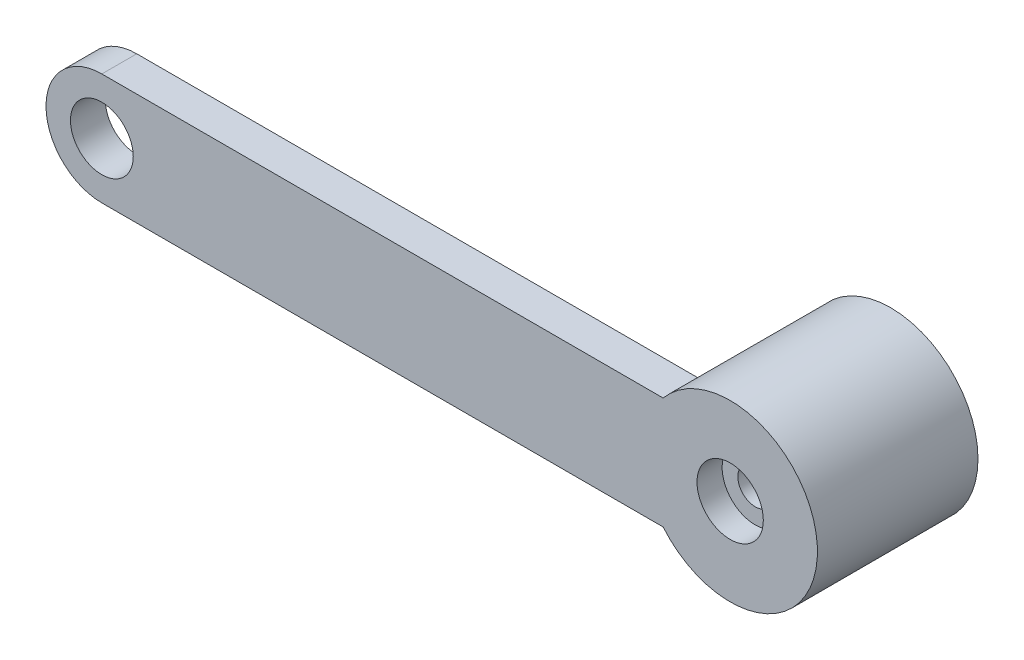
ISO-10303-21;
HEADER;
FILE_DESCRIPTION(('STEP AP214'),'2;1');
FILE_NAME('part.step','',(''),(''),'','','');
FILE_SCHEMA(('AUTOMOTIVE_DESIGN { 1 0 10303 214 1 1 1 1 }'));
ENDSEC;
DATA;
#1=APPLICATION_CONTEXT('core data for automotive mechanical design processes');
#2=APPLICATION_PROTOCOL_DEFINITION('international standard','automotive_design',2000,#1);
#3=PRODUCT_CONTEXT('',#1,'mechanical');
#4=PRODUCT('Part','Part','',(#3));
#5=PRODUCT_RELATED_PRODUCT_CATEGORY('part','',(#4));
#6=PRODUCT_DEFINITION_FORMATION('','',#4);
#7=PRODUCT_DEFINITION_CONTEXT('part definition',#1,'design');
#8=PRODUCT_DEFINITION('design','',#6,#7);
#9=PRODUCT_DEFINITION_SHAPE('','',#8);
#10=(LENGTH_UNIT() NAMED_UNIT(*) SI_UNIT(.MILLI.,.METRE.));
#11=(NAMED_UNIT(*) PLANE_ANGLE_UNIT() SI_UNIT($,.RADIAN.));
#12=(NAMED_UNIT(*) SI_UNIT($,.STERADIAN.) SOLID_ANGLE_UNIT());
#13=UNCERTAINTY_MEASURE_WITH_UNIT(LENGTH_MEASURE(1.E-05),#10,'distance_accuracy_value','');
#14=(GEOMETRIC_REPRESENTATION_CONTEXT(3) GLOBAL_UNCERTAINTY_ASSIGNED_CONTEXT((#13)) GLOBAL_UNIT_ASSIGNED_CONTEXT((#10,
#11,#12)) REPRESENTATION_CONTEXT('',''));
#15=CARTESIAN_POINT('',(0.,0.,0.));
#16=DIRECTION('',(0.,0.,1.));
#17=DIRECTION('',(1.,0.,0.));
#18=AXIS2_PLACEMENT_3D('',#15,#16,#17);
#19=CARTESIAN_POINT('',(52.6364834784347,0.,-18.001));
#20=DIRECTION('',(0.,0.,1.));
#21=DIRECTION('',(1.,0.,0.));
#22=AXIS2_PLACEMENT_3D('',#19,#20,#21);
#23=CYLINDRICAL_SURFACE('',#22,2.5);
#24=CARTESIAN_POINT('',(52.6364834784347,0.,-3.));
#25=DIRECTION('',(0.,0.,-1.));
#26=DIRECTION('',(-1.,0.,0.));
#27=AXIS2_PLACEMENT_3D('',#24,#25,#26);
#28=CIRCLE('',#27,2.5);
#29=CARTESIAN_POINT('',(50.1364834784347,0.,-3.));
#30=VERTEX_POINT('',#29);
#31=EDGE_CURVE('E144',#30,#30,#28,.F.);
#32=ORIENTED_EDGE('',*,*,#31,.F.);
#33=EDGE_LOOP('',(#32));
#34=FACE_BOUND('',#33,.T.);
#35=CARTESIAN_POINT('',(52.6364834784347,0.,1.4));
#36=DIRECTION('',(0.,0.,1.));
#37=DIRECTION('',(1.,0.,0.));
#38=AXIS2_PLACEMENT_3D('',#35,#36,#37);
#39=CIRCLE('',#38,2.5);
#40=CARTESIAN_POINT('',(55.1364834784347,0.,1.4));
#41=VERTEX_POINT('',#40);
#42=EDGE_CURVE('E43',#41,#41,#39,.F.);
#43=ORIENTED_EDGE('',*,*,#42,.F.);
#44=EDGE_LOOP('',(#43));
#45=FACE_BOUND('',#44,.T.);
#46=ADVANCED_FACE('F39',(#34,#45),#23,.F.);
#47=CARTESIAN_POINT('',(-37.3635165215653,0.,5.));
#48=DIRECTION('',(0.,0.,1.));
#49=DIRECTION('',(1.,0.,0.));
#50=AXIS2_PLACEMENT_3D('',#47,#48,#49);
#51=PLANE('',#50);
#52=CARTESIAN_POINT('',(52.6364834784347,0.,5.));
#53=DIRECTION('',(0.,0.,1.));
#54=DIRECTION('',(1.,0.,0.));
#55=AXIS2_PLACEMENT_3D('',#52,#53,#54);
#56=CIRCLE('',#55,4.75);
#57=CARTESIAN_POINT('',(57.3864834784347,0.,5.));
#58=VERTEX_POINT('',#57);
#59=EDGE_CURVE('E151',#58,#58,#56,.T.);
#60=ORIENTED_EDGE('',*,*,#59,.F.);
#61=EDGE_LOOP('',(#60));
#62=FACE_BOUND('',#61,.T.);
#63=CARTESIAN_POINT('',(-37.3635165215653,0.,5.));
#64=DIRECTION('',(0.,0.,1.));
#65=DIRECTION('',(1.,0.,0.));
#66=AXIS2_PLACEMENT_3D('',#63,#64,#65);
#67=CIRCLE('',#66,8.);
#68=CARTESIAN_POINT('',(-37.3635165215653,8.,5.));
#69=VERTEX_POINT('',#68);
#70=CARTESIAN_POINT('',(-37.3635165215653,-8.,5.));
#71=VERTEX_POINT('',#70);
#72=EDGE_CURVE('E93',#69,#71,#67,.T.);
#73=ORIENTED_EDGE('',*,*,#72,.T.);
#74=DIRECTION('',(1.,0.,0.));
#75=VECTOR('',#74,1.);
#76=CARTESIAN_POINT('',(-37.3635165215653,-8.,5.));
#77=LINE('',#76,#75);
#78=CARTESIAN_POINT('',(43.0317971222854,-8.,5.));
#79=VERTEX_POINT('',#78);
#80=EDGE_CURVE('E85',#71,#79,#77,.T.);
#81=ORIENTED_EDGE('',*,*,#80,.T.);
#82=CARTESIAN_POINT('',(52.6364834784347,0.,5.));
#83=DIRECTION('',(0.,0.,1.));
#84=DIRECTION('',(1.,0.,0.));
#85=AXIS2_PLACEMENT_3D('',#82,#83,#84);
#86=CIRCLE('',#85,12.5);
#87=CARTESIAN_POINT('',(43.0317971222854,8.,5.));
#88=VERTEX_POINT('',#87);
#89=EDGE_CURVE('E108',#79,#88,#86,.T.);
#90=ORIENTED_EDGE('',*,*,#89,.T.);
#91=DIRECTION('',(-1.,0.,0.));
#92=VECTOR('',#91,1.);
#93=CARTESIAN_POINT('',(-37.3635165215653,8.,5.));
#94=LINE('',#93,#92);
#95=EDGE_CURVE('E59',#88,#69,#94,.T.);
#96=ORIENTED_EDGE('',*,*,#95,.T.);
#97=EDGE_LOOP('',(#73,#81,#90,#96));
#98=FACE_BOUND('',#97,.T.);
#99=CARTESIAN_POINT('',(-37.3635165215653,0.,5.));
#100=DIRECTION('',(0.,0.,1.));
#101=DIRECTION('',(1.,0.,0.));
#102=AXIS2_PLACEMENT_3D('',#99,#100,#101);
#103=CIRCLE('',#102,4.5);
#104=CARTESIAN_POINT('',(-32.8635165215653,0.,5.));
#105=VERTEX_POINT('',#104);
#106=EDGE_CURVE('E119',#105,#105,#103,.T.);
#107=ORIENTED_EDGE('',*,*,#106,.F.);
#108=EDGE_LOOP('',(#107));
#109=FACE_BOUND('',#108,.T.);
#110=ADVANCED_FACE('F167',(#62,#98,#109),#51,.T.);
#111=CARTESIAN_POINT('',(-37.3635165215653,0.,0.));
#112=DIRECTION('',(0.,0.,1.));
#113=DIRECTION('',(1.,0.,0.));
#114=AXIS2_PLACEMENT_3D('',#111,#112,#113);
#115=PLANE('',#114);
#116=CARTESIAN_POINT('',(52.6364834784347,0.,0.));
#117=DIRECTION('',(0.,0.,-1.));
#118=DIRECTION('',(-1.,0.,0.));
#119=AXIS2_PLACEMENT_3D('',#116,#117,#118);
#120=CIRCLE('',#119,12.5);
#121=CARTESIAN_POINT('',(43.0317971222854,-8.,0.));
#122=VERTEX_POINT('',#121);
#123=CARTESIAN_POINT('',(43.0317971222854,8.,0.));
#124=VERTEX_POINT('',#123);
#125=EDGE_CURVE('E11',#122,#124,#120,.T.);
#126=ORIENTED_EDGE('',*,*,#125,.F.);
#127=DIRECTION('',(1.,0.,0.));
#128=VECTOR('',#127,1.);
#129=CARTESIAN_POINT('',(-37.3635165215653,-8.,0.));
#130=LINE('',#129,#128);
#131=CARTESIAN_POINT('',(-37.3635165215653,-8.,0.));
#132=VERTEX_POINT('',#131);
#133=EDGE_CURVE('E94',#132,#122,#130,.T.);
#134=ORIENTED_EDGE('',*,*,#133,.F.);
#135=CARTESIAN_POINT('',(-37.3635165215653,0.,0.));
#136=DIRECTION('',(0.,0.,1.));
#137=DIRECTION('',(1.,0.,0.));
#138=AXIS2_PLACEMENT_3D('',#135,#136,#137);
#139=CIRCLE('',#138,8.);
#140=CARTESIAN_POINT('',(-37.3635165215653,8.,0.));
#141=VERTEX_POINT('',#140);
#142=EDGE_CURVE('E91',#141,#132,#139,.T.);
#143=ORIENTED_EDGE('',*,*,#142,.F.);
#144=DIRECTION('',(-1.,0.,0.));
#145=VECTOR('',#144,1.);
#146=CARTESIAN_POINT('',(-37.3635165215653,8.,0.));
#147=LINE('',#146,#145);
#148=EDGE_CURVE('E77',#124,#141,#147,.T.);
#149=ORIENTED_EDGE('',*,*,#148,.F.);
#150=EDGE_LOOP('',(#126,#134,#143,#149));
#151=FACE_BOUND('',#150,.T.);
#152=CARTESIAN_POINT('',(-37.3635165215653,0.,0.));
#153=DIRECTION('',(0.,0.,1.));
#154=DIRECTION('',(1.,0.,0.));
#155=AXIS2_PLACEMENT_3D('',#152,#153,#154);
#156=CIRCLE('',#155,4.5);
#157=CARTESIAN_POINT('',(-32.8635165215653,0.,0.));
#158=VERTEX_POINT('',#157);
#159=EDGE_CURVE('E128',#158,#158,#156,.T.);
#160=ORIENTED_EDGE('',*,*,#159,.T.);
#161=EDGE_LOOP('',(#160));
#162=FACE_BOUND('',#161,.T.);
#163=ADVANCED_FACE('F88',(#151,#162),#115,.F.);
#164=CARTESIAN_POINT('',(-37.3635165215653,0.,5.));
#165=DIRECTION('',(0.,0.,-1.));
#166=DIRECTION('',(-1.,0.,0.));
#167=AXIS2_PLACEMENT_3D('',#164,#165,#166);
#168=CYLINDRICAL_SURFACE('',#167,8.);
#169=ORIENTED_EDGE('',*,*,#142,.T.);
#170=DIRECTION('',(0.,0.,-1.));
#171=VECTOR('',#170,1.);
#172=CARTESIAN_POINT('',(-37.3635165215653,-8.,5.));
#173=LINE('',#172,#171);
#174=EDGE_CURVE('E50',#71,#132,#173,.T.);
#175=ORIENTED_EDGE('',*,*,#174,.F.);
#176=ORIENTED_EDGE('',*,*,#72,.F.);
#177=DIRECTION('',(0.,0.,-1.));
#178=VECTOR('',#177,1.);
#179=CARTESIAN_POINT('',(-37.3635165215653,8.,5.));
#180=LINE('',#179,#178);
#181=EDGE_CURVE('E103',#69,#141,#180,.T.);
#182=ORIENTED_EDGE('',*,*,#181,.T.);
#183=EDGE_LOOP('',(#169,#175,#176,#182));
#184=FACE_BOUND('',#183,.T.);
#185=ADVANCED_FACE('F41',(#184),#168,.T.);
#186=CARTESIAN_POINT('',(-37.3635165215653,-8.,5.));
#187=DIRECTION('',(0.,1.,0.));
#188=DIRECTION('',(0.,0.,1.));
#189=AXIS2_PLACEMENT_3D('',#186,#187,#188);
#190=PLANE('',#189);
#191=ORIENTED_EDGE('',*,*,#133,.T.);
#192=DIRECTION('',(0.,0.,-1.));
#193=VECTOR('',#192,1.);
#194=CARTESIAN_POINT('',(43.0317971222854,-8.,5.));
#195=LINE('',#194,#193);
#196=EDGE_CURVE('E102',#79,#122,#195,.T.);
#197=ORIENTED_EDGE('',*,*,#196,.F.);
#198=ORIENTED_EDGE('',*,*,#80,.F.);
#199=ORIENTED_EDGE('',*,*,#174,.T.);
#200=EDGE_LOOP('',(#191,#197,#198,#199));
#201=FACE_BOUND('',#200,.T.);
#202=ADVANCED_FACE('F201',(#201),#190,.F.);
#203=CARTESIAN_POINT('',(52.6364834784347,0.,5.));
#204=DIRECTION('',(0.,0.,-1.));
#205=DIRECTION('',(-1.,0.,0.));
#206=AXIS2_PLACEMENT_3D('',#203,#204,#205);
#207=CYLINDRICAL_SURFACE('',#206,12.5);
#208=ORIENTED_EDGE('',*,*,#196,.T.);
#209=ORIENTED_EDGE('',*,*,#125,.T.);
#210=DIRECTION('',(0.,0.,-1.));
#211=VECTOR('',#210,1.);
#212=CARTESIAN_POINT('',(43.0317971222854,8.,5.));
#213=LINE('',#212,#211);
#214=EDGE_CURVE('E97',#88,#124,#213,.T.);
#215=ORIENTED_EDGE('',*,*,#214,.F.);
#216=ORIENTED_EDGE('',*,*,#89,.F.);
#217=EDGE_LOOP('',(#208,#209,#215,#216));
#218=FACE_BOUND('',#217,.T.);
#219=CARTESIAN_POINT('',(52.6364834784347,0.,-18.));
#220=DIRECTION('',(0.,0.,-1.));
#221=DIRECTION('',(-1.,0.,0.));
#222=AXIS2_PLACEMENT_3D('',#219,#220,#221);
#223=CIRCLE('',#222,12.5);
#224=CARTESIAN_POINT('',(40.1364834784347,0.,-18.));
#225=VERTEX_POINT('',#224);
#226=EDGE_CURVE('E132',#225,#225,#223,.T.);
#227=ORIENTED_EDGE('',*,*,#226,.F.);
#228=EDGE_LOOP('',(#227));
#229=FACE_BOUND('',#228,.T.);
#230=ADVANCED_FACE('F106',(#218,#229),#207,.T.);
#231=CARTESIAN_POINT('',(-37.3635165215653,8.,5.));
#232=DIRECTION('',(0.,-1.,0.));
#233=DIRECTION('',(0.,0.,-1.));
#234=AXIS2_PLACEMENT_3D('',#231,#232,#233);
#235=PLANE('',#234);
#236=ORIENTED_EDGE('',*,*,#148,.T.);
#237=ORIENTED_EDGE('',*,*,#181,.F.);
#238=ORIENTED_EDGE('',*,*,#95,.F.);
#239=ORIENTED_EDGE('',*,*,#214,.T.);
#240=EDGE_LOOP('',(#236,#237,#238,#239));
#241=FACE_BOUND('',#240,.T.);
#242=ADVANCED_FACE('F98',(#241),#235,.F.);
#243=CARTESIAN_POINT('',(-37.3635165215653,0.,5.));
#244=DIRECTION('',(0.,0.,-1.));
#245=DIRECTION('',(-1.,0.,0.));
#246=AXIS2_PLACEMENT_3D('',#243,#244,#245);
#247=CYLINDRICAL_SURFACE('',#246,4.5);
#248=ORIENTED_EDGE('',*,*,#106,.T.);
#249=EDGE_LOOP('',(#248));
#250=FACE_BOUND('',#249,.T.);
#251=ORIENTED_EDGE('',*,*,#159,.F.);
#252=EDGE_LOOP('',(#251));
#253=FACE_BOUND('',#252,.T.);
#254=ADVANCED_FACE('F191',(#250,#253),#247,.F.);
#255=CARTESIAN_POINT('',(52.6364834784347,0.,-18.));
#256=DIRECTION('',(0.,0.,-1.));
#257=DIRECTION('',(-1.,0.,0.));
#258=AXIS2_PLACEMENT_3D('',#255,#256,#257);
#259=PLANE('',#258);
#260=CARTESIAN_POINT('',(52.6364834784347,0.,-18.));
#261=DIRECTION('',(0.,0.,-1.));
#262=DIRECTION('',(-1.,0.,0.));
#263=AXIS2_PLACEMENT_3D('',#260,#261,#262);
#264=CIRCLE('',#263,9.);
#265=CARTESIAN_POINT('',(43.6364834784347,0.,-18.));
#266=VERTEX_POINT('',#265);
#267=EDGE_CURVE('E140',#266,#266,#264,.T.);
#268=ORIENTED_EDGE('',*,*,#267,.F.);
#269=EDGE_LOOP('',(#268));
#270=FACE_BOUND('',#269,.T.);
#271=ORIENTED_EDGE('',*,*,#226,.T.);
#272=EDGE_LOOP('',(#271));
#273=FACE_BOUND('',#272,.T.);
#274=ADVANCED_FACE('F187',(#270,#273),#259,.T.);
#275=CARTESIAN_POINT('',(52.6364834784347,0.,-3.));
#276=DIRECTION('',(0.,0.,-1.));
#277=DIRECTION('',(-1.,0.,0.));
#278=AXIS2_PLACEMENT_3D('',#275,#276,#277);
#279=CYLINDRICAL_SURFACE('',#278,9.);
#280=CARTESIAN_POINT('',(52.6364834784347,0.,-3.));
#281=DIRECTION('',(0.,0.,-1.));
#282=DIRECTION('',(-1.,0.,0.));
#283=AXIS2_PLACEMENT_3D('',#280,#281,#282);
#284=CIRCLE('',#283,9.);
#285=CARTESIAN_POINT('',(43.6364834784347,0.,-3.));
#286=VERTEX_POINT('',#285);
#287=EDGE_CURVE('E139',#286,#286,#284,.T.);
#288=ORIENTED_EDGE('',*,*,#287,.F.);
#289=EDGE_LOOP('',(#288));
#290=FACE_BOUND('',#289,.T.);
#291=ORIENTED_EDGE('',*,*,#267,.T.);
#292=EDGE_LOOP('',(#291));
#293=FACE_BOUND('',#292,.T.);
#294=ADVANCED_FACE('F183',(#290,#293),#279,.F.);
#295=CARTESIAN_POINT('',(52.6364834784347,0.,-3.));
#296=DIRECTION('',(0.,0.,-1.));
#297=DIRECTION('',(-1.,0.,0.));
#298=AXIS2_PLACEMENT_3D('',#295,#296,#297);
#299=PLANE('',#298);
#300=ORIENTED_EDGE('',*,*,#31,.T.);
#301=EDGE_LOOP('',(#300));
#302=FACE_BOUND('',#301,.T.);
#303=ORIENTED_EDGE('',*,*,#287,.T.);
#304=EDGE_LOOP('',(#303));
#305=FACE_BOUND('',#304,.T.);
#306=ADVANCED_FACE('F180',(#302,#305),#299,.T.);
#307=CARTESIAN_POINT('',(52.6364834784347,0.,1.4));
#308=DIRECTION('',(0.,0.,1.));
#309=DIRECTION('',(1.,0.,0.));
#310=AXIS2_PLACEMENT_3D('',#307,#308,#309);
#311=PLANE('',#310);
#312=CARTESIAN_POINT('',(52.6364834784347,0.,1.4));
#313=DIRECTION('',(0.,0.,1.));
#314=DIRECTION('',(1.,0.,0.));
#315=AXIS2_PLACEMENT_3D('',#312,#313,#314);
#316=CIRCLE('',#315,4.75);
#317=CARTESIAN_POINT('',(57.3864834784347,0.,1.4));
#318=VERTEX_POINT('',#317);
#319=EDGE_CURVE('E155',#318,#318,#316,.T.);
#320=ORIENTED_EDGE('',*,*,#319,.T.);
#321=EDGE_LOOP('',(#320));
#322=FACE_BOUND('',#321,.T.);
#323=ORIENTED_EDGE('',*,*,#42,.T.);
#324=EDGE_LOOP('',(#323));
#325=FACE_BOUND('',#324,.T.);
#326=ADVANCED_FACE('F164',(#322,#325),#311,.T.);
#327=CARTESIAN_POINT('',(52.6364834784347,0.,1.4));
#328=DIRECTION('',(0.,0.,1.));
#329=DIRECTION('',(1.,0.,0.));
#330=AXIS2_PLACEMENT_3D('',#327,#328,#329);
#331=CYLINDRICAL_SURFACE('',#330,4.75);
#332=ORIENTED_EDGE('',*,*,#319,.F.);
#333=EDGE_LOOP('',(#332));
#334=FACE_BOUND('',#333,.T.);
#335=ORIENTED_EDGE('',*,*,#59,.T.);
#336=EDGE_LOOP('',(#335));
#337=FACE_BOUND('',#336,.T.);
#338=ADVANCED_FACE('F178',(#334,#337),#331,.F.);
#339=CLOSED_SHELL('',(#46,#110,#163,#185,#202,#230,#242,#254,#274,#294,#306,#326,#338));
#340=MANIFOLD_SOLID_BREP('B2',#339);
#341=ADVANCED_BREP_SHAPE_REPRESENTATION('',(#18,#340),#14);
#342=SHAPE_DEFINITION_REPRESENTATION(#9,#341);
ENDSEC;
END-ISO-10303-21;
